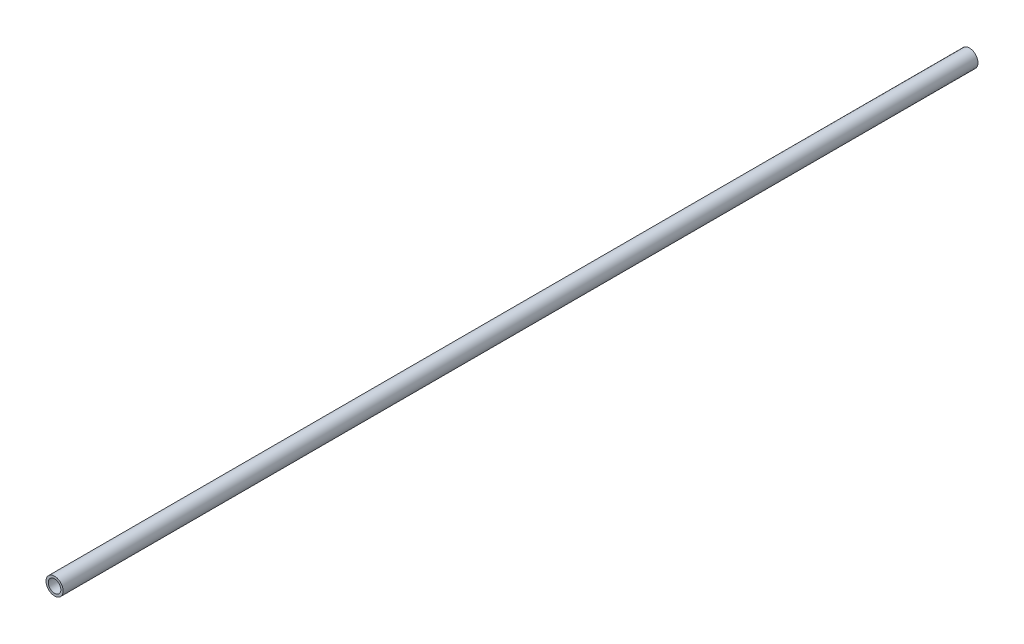
ISO-10303-21;
HEADER;
FILE_DESCRIPTION(('STEP AP214'),'2;1');
FILE_NAME('part.step','',(''),(''),'','','');
FILE_SCHEMA(('AUTOMOTIVE_DESIGN { 1 0 10303 214 1 1 1 1 }'));
ENDSEC;
DATA;
#1=APPLICATION_CONTEXT('core data for automotive mechanical design processes');
#2=APPLICATION_PROTOCOL_DEFINITION('international standard','automotive_design',2000,#1);
#3=PRODUCT_CONTEXT('',#1,'mechanical');
#4=PRODUCT('Part','Part','',(#3));
#5=PRODUCT_RELATED_PRODUCT_CATEGORY('part','',(#4));
#6=PRODUCT_DEFINITION_FORMATION('','',#4);
#7=PRODUCT_DEFINITION_CONTEXT('part definition',#1,'design');
#8=PRODUCT_DEFINITION('design','',#6,#7);
#9=PRODUCT_DEFINITION_SHAPE('','',#8);
#10=(LENGTH_UNIT() NAMED_UNIT(*) SI_UNIT(.MILLI.,.METRE.));
#11=(NAMED_UNIT(*) PLANE_ANGLE_UNIT() SI_UNIT($,.RADIAN.));
#12=(NAMED_UNIT(*) SI_UNIT($,.STERADIAN.) SOLID_ANGLE_UNIT());
#13=UNCERTAINTY_MEASURE_WITH_UNIT(LENGTH_MEASURE(1.E-05),#10,'distance_accuracy_value','');
#14=(GEOMETRIC_REPRESENTATION_CONTEXT(3) GLOBAL_UNCERTAINTY_ASSIGNED_CONTEXT((#13)) GLOBAL_UNIT_ASSIGNED_CONTEXT((#10,
#11,#12)) REPRESENTATION_CONTEXT('',''));
#15=CARTESIAN_POINT('',(0.,0.,0.));
#16=DIRECTION('',(0.,0.,1.));
#17=DIRECTION('',(1.,0.,0.));
#18=AXIS2_PLACEMENT_3D('',#15,#16,#17);
#19=CARTESIAN_POINT('',(-32.8992814964538,249.847725302664,400.));
#20=DIRECTION('',(0.,0.,1.));
#21=DIRECTION('',(1.,0.,0.));
#22=AXIS2_PLACEMENT_3D('',#19,#20,#21);
#23=PLANE('',#22);
#24=CARTESIAN_POINT('',(-32.8992814964538,249.847725302664,400.));
#25=DIRECTION('',(0.,0.,1.));
#26=DIRECTION('',(1.,0.,0.));
#27=AXIS2_PLACEMENT_3D('',#24,#25,#26);
#28=CIRCLE('',#27,3.75);
#29=CARTESIAN_POINT('',(-29.1492814964538,249.847725302664,400.));
#30=VERTEX_POINT('',#29);
#31=EDGE_CURVE('E10',#30,#30,#28,.T.);
#32=ORIENTED_EDGE('',*,*,#31,.T.);
#33=EDGE_LOOP('',(#32));
#34=FACE_BOUND('',#33,.T.);
#35=CARTESIAN_POINT('',(-32.8992814964538,249.847725302664,400.));
#36=DIRECTION('',(0.,0.,1.));
#37=DIRECTION('',(1.,0.,0.));
#38=AXIS2_PLACEMENT_3D('',#35,#36,#37);
#39=CIRCLE('',#38,2.75);
#40=CARTESIAN_POINT('',(-30.1492814964538,249.847725302664,400.));
#41=VERTEX_POINT('',#40);
#42=EDGE_CURVE('E43',#41,#41,#39,.T.);
#43=ORIENTED_EDGE('',*,*,#42,.F.);
#44=EDGE_LOOP('',(#43));
#45=FACE_BOUND('',#44,.T.);
#46=ADVANCED_FACE('F32',(#34,#45),#23,.T.);
#47=CARTESIAN_POINT('',(-32.8992814964538,249.847725302664,0.));
#48=DIRECTION('',(0.,0.,1.));
#49=DIRECTION('',(1.,0.,0.));
#50=AXIS2_PLACEMENT_3D('',#47,#48,#49);
#51=PLANE('',#50);
#52=CARTESIAN_POINT('',(-32.8992814964538,249.847725302664,0.));
#53=DIRECTION('',(0.,0.,1.));
#54=DIRECTION('',(1.,0.,0.));
#55=AXIS2_PLACEMENT_3D('',#52,#53,#54);
#56=CIRCLE('',#55,3.75);
#57=CARTESIAN_POINT('',(-29.1492814964538,249.847725302664,0.));
#58=VERTEX_POINT('',#57);
#59=EDGE_CURVE('E36',#58,#58,#56,.T.);
#60=ORIENTED_EDGE('',*,*,#59,.F.);
#61=EDGE_LOOP('',(#60));
#62=FACE_BOUND('',#61,.T.);
#63=CARTESIAN_POINT('',(-32.8992814964538,249.847725302664,0.));
#64=DIRECTION('',(0.,0.,1.));
#65=DIRECTION('',(1.,0.,0.));
#66=AXIS2_PLACEMENT_3D('',#63,#64,#65);
#67=CIRCLE('',#66,2.75);
#68=CARTESIAN_POINT('',(-30.1492814964538,249.847725302664,0.));
#69=VERTEX_POINT('',#68);
#70=EDGE_CURVE('E45',#69,#69,#67,.T.);
#71=ORIENTED_EDGE('',*,*,#70,.T.);
#72=EDGE_LOOP('',(#71));
#73=FACE_BOUND('',#72,.T.);
#74=ADVANCED_FACE('F55',(#62,#73),#51,.F.);
#75=CARTESIAN_POINT('',(-32.8992814964538,249.847725302664,400.));
#76=DIRECTION('',(0.,0.,-1.));
#77=DIRECTION('',(-1.,0.,0.));
#78=AXIS2_PLACEMENT_3D('',#75,#76,#77);
#79=CYLINDRICAL_SURFACE('',#78,3.75);
#80=ORIENTED_EDGE('',*,*,#31,.F.);
#81=EDGE_LOOP('',(#80));
#82=FACE_BOUND('',#81,.T.);
#83=ORIENTED_EDGE('',*,*,#59,.T.);
#84=EDGE_LOOP('',(#83));
#85=FACE_BOUND('',#84,.T.);
#86=ADVANCED_FACE('F34',(#82,#85),#79,.T.);
#87=CARTESIAN_POINT('',(-32.8992814964538,249.847725302664,400.));
#88=DIRECTION('',(0.,0.,-1.));
#89=DIRECTION('',(-1.,0.,0.));
#90=AXIS2_PLACEMENT_3D('',#87,#88,#89);
#91=CYLINDRICAL_SURFACE('',#90,2.75);
#92=ORIENTED_EDGE('',*,*,#42,.T.);
#93=EDGE_LOOP('',(#92));
#94=FACE_BOUND('',#93,.T.);
#95=ORIENTED_EDGE('',*,*,#70,.F.);
#96=EDGE_LOOP('',(#95));
#97=FACE_BOUND('',#96,.T.);
#98=ADVANCED_FACE('F51',(#94,#97),#91,.F.);
#99=CLOSED_SHELL('',(#46,#74,#86,#98));
#100=MANIFOLD_SOLID_BREP('B2',#99);
#101=ADVANCED_BREP_SHAPE_REPRESENTATION('',(#18,#100),#14);
#102=SHAPE_DEFINITION_REPRESENTATION(#9,#101);
ENDSEC;
END-ISO-10303-21;
